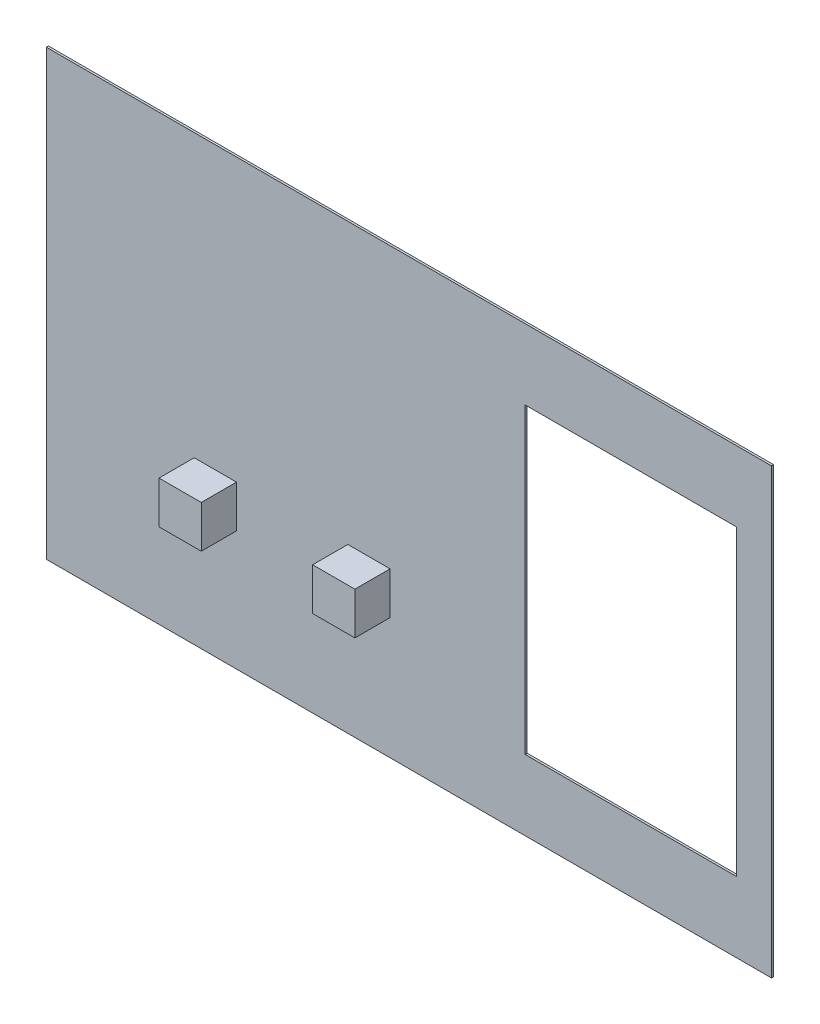
ISO-10303-21;
HEADER;
FILE_DESCRIPTION(('STEP AP214'),'2;1');
FILE_NAME('part.step','',(''),(''),'','','');
FILE_SCHEMA(('AUTOMOTIVE_DESIGN { 1 0 10303 214 1 1 1 1 }'));
ENDSEC;
DATA;
#1=APPLICATION_CONTEXT('core data for automotive mechanical design processes');
#2=APPLICATION_PROTOCOL_DEFINITION('international standard','automotive_design',2000,#1);
#3=PRODUCT_CONTEXT('',#1,'mechanical');
#4=PRODUCT('Part','Part','',(#3));
#5=PRODUCT_RELATED_PRODUCT_CATEGORY('part','',(#4));
#6=PRODUCT_DEFINITION_FORMATION('','',#4);
#7=PRODUCT_DEFINITION_CONTEXT('part definition',#1,'design');
#8=PRODUCT_DEFINITION('design','',#6,#7);
#9=PRODUCT_DEFINITION_SHAPE('','',#8);
#10=(LENGTH_UNIT() NAMED_UNIT(*) SI_UNIT(.MILLI.,.METRE.));
#11=(NAMED_UNIT(*) PLANE_ANGLE_UNIT() SI_UNIT($,.RADIAN.));
#12=(NAMED_UNIT(*) SI_UNIT($,.STERADIAN.) SOLID_ANGLE_UNIT());
#13=UNCERTAINTY_MEASURE_WITH_UNIT(LENGTH_MEASURE(1.E-05),#10,'distance_accuracy_value','');
#14=(GEOMETRIC_REPRESENTATION_CONTEXT(3) GLOBAL_UNCERTAINTY_ASSIGNED_CONTEXT((#13)) GLOBAL_UNIT_ASSIGNED_CONTEXT((#10,
#11,#12)) REPRESENTATION_CONTEXT('',''));
#15=CARTESIAN_POINT('',(0.,0.,0.));
#16=DIRECTION('',(0.,0.,1.));
#17=DIRECTION('',(1.,0.,0.));
#18=AXIS2_PLACEMENT_3D('',#15,#16,#17);
#19=CARTESIAN_POINT('',(-26.7765595074968,-82.5431676674339,53.));
#20=DIRECTION('',(-1.,0.,0.));
#21=DIRECTION('',(0.,-1.,0.));
#22=AXIS2_PLACEMENT_3D('',#19,#20,#21);
#23=PLANE('',#22);
#24=DIRECTION('',(0.,1.,0.));
#25=VECTOR('',#24,1.);
#26=CARTESIAN_POINT('',(-26.7765595074968,-82.5431676674339,3.));
#27=LINE('',#26,#25);
#28=CARTESIAN_POINT('',(-26.7765595074968,-142.543167667434,3.));
#29=VERTEX_POINT('',#28);
#30=CARTESIAN_POINT('',(-26.7765595074968,-82.5431676674339,3.));
#31=VERTEX_POINT('',#30);
#32=EDGE_CURVE('E107',#29,#31,#27,.T.);
#33=ORIENTED_EDGE('',*,*,#32,.T.);
#34=DIRECTION('',(0.,0.,-1.));
#35=VECTOR('',#34,1.);
#36=CARTESIAN_POINT('',(-26.7765595074968,-82.5431676674339,53.));
#37=LINE('',#36,#35);
#38=CARTESIAN_POINT('',(-26.7765595074968,-82.5431676674339,53.));
#39=VERTEX_POINT('',#38);
#40=EDGE_CURVE('E12',#39,#31,#37,.T.);
#41=ORIENTED_EDGE('',*,*,#40,.F.);
#42=DIRECTION('',(0.,1.,0.));
#43=VECTOR('',#42,1.);
#44=CARTESIAN_POINT('',(-26.7765595074968,-82.5431676674339,53.));
#45=LINE('',#44,#43);
#46=CARTESIAN_POINT('',(-26.7765595074968,-142.543167667434,53.));
#47=VERTEX_POINT('',#46);
#48=EDGE_CURVE('E95',#47,#39,#45,.T.);
#49=ORIENTED_EDGE('',*,*,#48,.F.);
#50=DIRECTION('',(0.,0.,-1.));
#51=VECTOR('',#50,1.);
#52=CARTESIAN_POINT('',(-26.7765595074968,-142.543167667434,53.));
#53=LINE('',#52,#51);
#54=EDGE_CURVE('E103',#47,#29,#53,.T.);
#55=ORIENTED_EDGE('',*,*,#54,.T.);
#56=EDGE_LOOP('',(#33,#41,#49,#55));
#57=FACE_BOUND('',#56,.T.);
#58=ADVANCED_FACE('F44',(#57),#23,.F.);
#59=CARTESIAN_POINT('',(-86.7765595074968,-82.5431676674339,53.));
#60=DIRECTION('',(0.,-1.,0.));
#61=DIRECTION('',(0.,0.,-1.));
#62=AXIS2_PLACEMENT_3D('',#59,#60,#61);
#63=PLANE('',#62);
#64=DIRECTION('',(-1.,0.,0.));
#65=VECTOR('',#64,1.);
#66=CARTESIAN_POINT('',(-86.7765595074968,-82.5431676674339,3.));
#67=LINE('',#66,#65);
#68=CARTESIAN_POINT('',(-86.7765595074968,-82.5431676674339,3.));
#69=VERTEX_POINT('',#68);
#70=EDGE_CURVE('E99',#31,#69,#67,.T.);
#71=ORIENTED_EDGE('',*,*,#70,.T.);
#72=DIRECTION('',(0.,0.,-1.));
#73=VECTOR('',#72,1.);
#74=CARTESIAN_POINT('',(-86.7765595074968,-82.5431676674339,53.));
#75=LINE('',#74,#73);
#76=CARTESIAN_POINT('',(-86.7765595074968,-82.5431676674339,53.));
#77=VERTEX_POINT('',#76);
#78=EDGE_CURVE('E52',#77,#69,#75,.T.);
#79=ORIENTED_EDGE('',*,*,#78,.F.);
#80=DIRECTION('',(-1.,0.,0.));
#81=VECTOR('',#80,1.);
#82=CARTESIAN_POINT('',(-86.7765595074968,-82.5431676674339,53.));
#83=LINE('',#82,#81);
#84=EDGE_CURVE('E90',#39,#77,#83,.T.);
#85=ORIENTED_EDGE('',*,*,#84,.F.);
#86=ORIENTED_EDGE('',*,*,#40,.T.);
#87=EDGE_LOOP('',(#71,#79,#85,#86));
#88=FACE_BOUND('',#87,.T.);
#89=ADVANCED_FACE('F98',(#88),#63,.F.);
#90=CARTESIAN_POINT('',(-86.7765595074968,-142.543167667434,53.));
#91=DIRECTION('',(1.,0.,0.));
#92=DIRECTION('',(0.,1.,0.));
#93=AXIS2_PLACEMENT_3D('',#90,#91,#92);
#94=PLANE('',#93);
#95=DIRECTION('',(0.,-1.,0.));
#96=VECTOR('',#95,1.);
#97=CARTESIAN_POINT('',(-86.7765595074968,-142.543167667434,3.));
#98=LINE('',#97,#96);
#99=CARTESIAN_POINT('',(-86.7765595074968,-142.543167667434,3.));
#100=VERTEX_POINT('',#99);
#101=EDGE_CURVE('E77',#69,#100,#98,.T.);
#102=ORIENTED_EDGE('',*,*,#101,.T.);
#103=DIRECTION('',(0.,0.,-1.));
#104=VECTOR('',#103,1.);
#105=CARTESIAN_POINT('',(-86.7765595074968,-142.543167667434,53.));
#106=LINE('',#105,#104);
#107=CARTESIAN_POINT('',(-86.7765595074968,-142.543167667434,53.));
#108=VERTEX_POINT('',#107);
#109=EDGE_CURVE('E100',#108,#100,#106,.T.);
#110=ORIENTED_EDGE('',*,*,#109,.F.);
#111=DIRECTION('',(0.,-1.,0.));
#112=VECTOR('',#111,1.);
#113=CARTESIAN_POINT('',(-86.7765595074968,-142.543167667434,53.));
#114=LINE('',#113,#112);
#115=EDGE_CURVE('E93',#77,#108,#114,.T.);
#116=ORIENTED_EDGE('',*,*,#115,.F.);
#117=ORIENTED_EDGE('',*,*,#78,.T.);
#118=EDGE_LOOP('',(#102,#110,#116,#117));
#119=FACE_BOUND('',#118,.T.);
#120=ADVANCED_FACE('F101',(#119),#94,.F.);
#121=CARTESIAN_POINT('',(-26.7765595074968,-142.543167667434,53.));
#122=DIRECTION('',(0.,1.,0.));
#123=DIRECTION('',(0.,0.,1.));
#124=AXIS2_PLACEMENT_3D('',#121,#122,#123);
#125=PLANE('',#124);
#126=DIRECTION('',(1.,0.,0.));
#127=VECTOR('',#126,1.);
#128=CARTESIAN_POINT('',(-26.7765595074968,-142.543167667434,3.));
#129=LINE('',#128,#127);
#130=EDGE_CURVE('E83',#100,#29,#129,.T.);
#131=ORIENTED_EDGE('',*,*,#130,.T.);
#132=ORIENTED_EDGE('',*,*,#54,.F.);
#133=DIRECTION('',(1.,0.,0.));
#134=VECTOR('',#133,1.);
#135=CARTESIAN_POINT('',(-26.7765595074968,-142.543167667434,53.));
#136=LINE('',#135,#134);
#137=EDGE_CURVE('E60',#108,#47,#136,.T.);
#138=ORIENTED_EDGE('',*,*,#137,.F.);
#139=ORIENTED_EDGE('',*,*,#109,.T.);
#140=EDGE_LOOP('',(#131,#132,#138,#139));
#141=FACE_BOUND('',#140,.T.);
#142=ADVANCED_FACE('F114',(#141),#125,.F.);
#143=CARTESIAN_POINT('',(0.,0.,53.));
#144=DIRECTION('',(0.,0.,-1.));
#145=DIRECTION('',(-1.,0.,0.));
#146=AXIS2_PLACEMENT_3D('',#143,#144,#145);
#147=PLANE('',#146);
#148=ORIENTED_EDGE('',*,*,#48,.T.);
#149=ORIENTED_EDGE('',*,*,#84,.T.);
#150=ORIENTED_EDGE('',*,*,#115,.T.);
#151=ORIENTED_EDGE('',*,*,#137,.T.);
#152=EDGE_LOOP('',(#148,#149,#150,#151));
#153=FACE_BOUND('',#152,.T.);
#154=ADVANCED_FACE('F91',(#153),#147,.F.);
#155=CARTESIAN_POINT('',(0.,0.,3.));
#156=DIRECTION('',(0.,0.,-1.));
#157=DIRECTION('',(-1.,0.,0.));
#158=AXIS2_PLACEMENT_3D('',#155,#156,#157);
#159=PLANE('',#158);
#160=ORIENTED_EDGE('',*,*,#32,.F.);
#161=ORIENTED_EDGE('',*,*,#130,.F.);
#162=ORIENTED_EDGE('',*,*,#101,.F.);
#163=ORIENTED_EDGE('',*,*,#70,.F.);
#164=EDGE_LOOP('',(#160,#161,#162,#163));
#165=FACE_BOUND('',#164,.T.);
#166=ADVANCED_FACE('F117',(#165),#159,.T.);
#167=CLOSED_SHELL('',(#58,#89,#120,#142,#154,#166));
#168=MANIFOLD_SOLID_BREP('B2',#167);
#169=CARTESIAN_POINT('',(-245.,-85.,53.));
#170=DIRECTION('',(-1.,0.,0.));
#171=DIRECTION('',(0.,0.,1.));
#172=AXIS2_PLACEMENT_3D('',#169,#170,#171);
#173=PLANE('',#172);
#174=DIRECTION('',(0.,1.,0.));
#175=VECTOR('',#174,1.);
#176=CARTESIAN_POINT('',(-245.,-85.,3.));
#177=LINE('',#176,#175);
#178=CARTESIAN_POINT('',(-245.,-145.,3.));
#179=VERTEX_POINT('',#178);
#180=CARTESIAN_POINT('',(-245.,-85.,3.));
#181=VERTEX_POINT('',#180);
#182=EDGE_CURVE('E240',#179,#181,#177,.T.);
#183=ORIENTED_EDGE('',*,*,#182,.T.);
#184=DIRECTION('',(0.,0.,-1.));
#185=VECTOR('',#184,1.);
#186=CARTESIAN_POINT('',(-245.,-85.,53.));
#187=LINE('',#186,#185);
#188=CARTESIAN_POINT('',(-245.,-85.,53.));
#189=VERTEX_POINT('',#188);
#190=EDGE_CURVE('E42',#189,#181,#187,.T.);
#191=ORIENTED_EDGE('',*,*,#190,.F.);
#192=DIRECTION('',(0.,1.,0.));
#193=VECTOR('',#192,1.);
#194=CARTESIAN_POINT('',(-245.,-85.,53.));
#195=LINE('',#194,#193);
#196=CARTESIAN_POINT('',(-245.,-145.,53.));
#197=VERTEX_POINT('',#196);
#198=EDGE_CURVE('E228',#197,#189,#195,.T.);
#199=ORIENTED_EDGE('',*,*,#198,.F.);
#200=DIRECTION('',(0.,0.,-1.));
#201=VECTOR('',#200,1.);
#202=CARTESIAN_POINT('',(-245.,-145.,53.));
#203=LINE('',#202,#201);
#204=EDGE_CURVE('E236',#197,#179,#203,.T.);
#205=ORIENTED_EDGE('',*,*,#204,.T.);
#206=EDGE_LOOP('',(#183,#191,#199,#205));
#207=FACE_BOUND('',#206,.T.);
#208=ADVANCED_FACE('F177',(#207),#173,.F.);
#209=CARTESIAN_POINT('',(-305.,-85.,53.));
#210=DIRECTION('',(0.,-1.,0.));
#211=DIRECTION('',(1.,0.,0.));
#212=AXIS2_PLACEMENT_3D('',#209,#210,#211);
#213=PLANE('',#212);
#214=DIRECTION('',(-1.,0.,0.));
#215=VECTOR('',#214,1.);
#216=CARTESIAN_POINT('',(-305.,-85.,3.));
#217=LINE('',#216,#215);
#218=CARTESIAN_POINT('',(-305.,-85.,3.));
#219=VERTEX_POINT('',#218);
#220=EDGE_CURVE('E232',#181,#219,#217,.T.);
#221=ORIENTED_EDGE('',*,*,#220,.T.);
#222=DIRECTION('',(0.,0.,-1.));
#223=VECTOR('',#222,1.);
#224=CARTESIAN_POINT('',(-305.,-85.,53.));
#225=LINE('',#224,#223);
#226=CARTESIAN_POINT('',(-305.,-85.,53.));
#227=VERTEX_POINT('',#226);
#228=EDGE_CURVE('E185',#227,#219,#225,.T.);
#229=ORIENTED_EDGE('',*,*,#228,.F.);
#230=DIRECTION('',(-1.,0.,0.));
#231=VECTOR('',#230,1.);
#232=CARTESIAN_POINT('',(-305.,-85.,53.));
#233=LINE('',#232,#231);
#234=EDGE_CURVE('E223',#189,#227,#233,.T.);
#235=ORIENTED_EDGE('',*,*,#234,.F.);
#236=ORIENTED_EDGE('',*,*,#190,.T.);
#237=EDGE_LOOP('',(#221,#229,#235,#236));
#238=FACE_BOUND('',#237,.T.);
#239=ADVANCED_FACE('F231',(#238),#213,.F.);
#240=CARTESIAN_POINT('',(-305.,-145.,53.));
#241=DIRECTION('',(1.,0.,0.));
#242=DIRECTION('',(0.,0.,-1.));
#243=AXIS2_PLACEMENT_3D('',#240,#241,#242);
#244=PLANE('',#243);
#245=DIRECTION('',(0.,-1.,0.));
#246=VECTOR('',#245,1.);
#247=CARTESIAN_POINT('',(-305.,-145.,3.));
#248=LINE('',#247,#246);
#249=CARTESIAN_POINT('',(-305.,-145.,3.));
#250=VERTEX_POINT('',#249);
#251=EDGE_CURVE('E210',#219,#250,#248,.T.);
#252=ORIENTED_EDGE('',*,*,#251,.T.);
#253=DIRECTION('',(0.,0.,-1.));
#254=VECTOR('',#253,1.);
#255=CARTESIAN_POINT('',(-305.,-145.,53.));
#256=LINE('',#255,#254);
#257=CARTESIAN_POINT('',(-305.,-145.,53.));
#258=VERTEX_POINT('',#257);
#259=EDGE_CURVE('E233',#258,#250,#256,.T.);
#260=ORIENTED_EDGE('',*,*,#259,.F.);
#261=DIRECTION('',(0.,-1.,0.));
#262=VECTOR('',#261,1.);
#263=CARTESIAN_POINT('',(-305.,-145.,53.));
#264=LINE('',#263,#262);
#265=EDGE_CURVE('E226',#227,#258,#264,.T.);
#266=ORIENTED_EDGE('',*,*,#265,.F.);
#267=ORIENTED_EDGE('',*,*,#228,.T.);
#268=EDGE_LOOP('',(#252,#260,#266,#267));
#269=FACE_BOUND('',#268,.T.);
#270=ADVANCED_FACE('F234',(#269),#244,.F.);
#271=CARTESIAN_POINT('',(-245.,-145.,53.));
#272=DIRECTION('',(0.,1.,0.));
#273=DIRECTION('',(0.,0.,1.));
#274=AXIS2_PLACEMENT_3D('',#271,#272,#273);
#275=PLANE('',#274);
#276=DIRECTION('',(1.,0.,0.));
#277=VECTOR('',#276,1.);
#278=CARTESIAN_POINT('',(-245.,-145.,3.));
#279=LINE('',#278,#277);
#280=EDGE_CURVE('E216',#250,#179,#279,.T.);
#281=ORIENTED_EDGE('',*,*,#280,.T.);
#282=ORIENTED_EDGE('',*,*,#204,.F.);
#283=DIRECTION('',(1.,0.,0.));
#284=VECTOR('',#283,1.);
#285=CARTESIAN_POINT('',(-245.,-145.,53.));
#286=LINE('',#285,#284);
#287=EDGE_CURVE('E193',#258,#197,#286,.T.);
#288=ORIENTED_EDGE('',*,*,#287,.F.);
#289=ORIENTED_EDGE('',*,*,#259,.T.);
#290=EDGE_LOOP('',(#281,#282,#288,#289));
#291=FACE_BOUND('',#290,.T.);
#292=ADVANCED_FACE('F247',(#291),#275,.F.);
#293=CARTESIAN_POINT('',(0.,0.,53.));
#294=DIRECTION('',(0.,0.,-1.));
#295=DIRECTION('',(-1.,0.,0.));
#296=AXIS2_PLACEMENT_3D('',#293,#294,#295);
#297=PLANE('',#296);
#298=ORIENTED_EDGE('',*,*,#198,.T.);
#299=ORIENTED_EDGE('',*,*,#234,.T.);
#300=ORIENTED_EDGE('',*,*,#265,.T.);
#301=ORIENTED_EDGE('',*,*,#287,.T.);
#302=EDGE_LOOP('',(#298,#299,#300,#301));
#303=FACE_BOUND('',#302,.T.);
#304=ADVANCED_FACE('F224',(#303),#297,.F.);
#305=CARTESIAN_POINT('',(0.,0.,3.));
#306=DIRECTION('',(0.,0.,-1.));
#307=DIRECTION('',(-1.,0.,0.));
#308=AXIS2_PLACEMENT_3D('',#305,#306,#307);
#309=PLANE('',#308);
#310=ORIENTED_EDGE('',*,*,#182,.F.);
#311=ORIENTED_EDGE('',*,*,#280,.F.);
#312=ORIENTED_EDGE('',*,*,#251,.F.);
#313=ORIENTED_EDGE('',*,*,#220,.F.);
#314=EDGE_LOOP('',(#310,#311,#312,#313));
#315=FACE_BOUND('',#314,.T.);
#316=ADVANCED_FACE('F250',(#315),#309,.T.);
#317=CLOSED_SHELL('',(#208,#239,#270,#292,#304,#316));
#318=MANIFOLD_SOLID_BREP('B6',#317);
#319=CARTESIAN_POINT('',(515.,-315.,3.));
#320=DIRECTION('',(-1.,0.,0.));
#321=DIRECTION('',(0.,0.,1.));
#322=AXIS2_PLACEMENT_3D('',#319,#320,#321);
#323=PLANE('',#322);
#324=DIRECTION('',(0.,1.,0.));
#325=VECTOR('',#324,1.);
#326=CARTESIAN_POINT('',(515.,-315.,0.));
#327=LINE('',#326,#325);
#328=CARTESIAN_POINT('',(515.,-315.,0.));
#329=VERTEX_POINT('',#328);
#330=CARTESIAN_POINT('',(515.,315.,0.));
#331=VERTEX_POINT('',#330);
#332=EDGE_CURVE('E520',#329,#331,#327,.T.);
#333=ORIENTED_EDGE('',*,*,#332,.T.);
#334=DIRECTION('',(0.,0.,-1.));
#335=VECTOR('',#334,1.);
#336=CARTESIAN_POINT('',(515.,315.,3.));
#337=LINE('',#336,#335);
#338=CARTESIAN_POINT('',(515.,315.,3.));
#339=VERTEX_POINT('',#338);
#340=EDGE_CURVE('E175',#339,#331,#337,.T.);
#341=ORIENTED_EDGE('',*,*,#340,.F.);
#342=DIRECTION('',(0.,1.,0.));
#343=VECTOR('',#342,1.);
#344=CARTESIAN_POINT('',(515.,-315.,3.));
#345=LINE('',#344,#343);
#346=CARTESIAN_POINT('',(515.,-315.,3.));
#347=VERTEX_POINT('',#346);
#348=EDGE_CURVE('E521',#347,#339,#345,.T.);
#349=ORIENTED_EDGE('',*,*,#348,.F.);
#350=DIRECTION('',(0.,0.,-1.));
#351=VECTOR('',#350,1.);
#352=CARTESIAN_POINT('',(515.,-315.,3.));
#353=LINE('',#352,#351);
#354=EDGE_CURVE('E531',#347,#329,#353,.T.);
#355=ORIENTED_EDGE('',*,*,#354,.T.);
#356=EDGE_LOOP('',(#333,#341,#349,#355));
#357=FACE_BOUND('',#356,.T.);
#358=ADVANCED_FACE('F301',(#357),#323,.F.);
#359=CARTESIAN_POINT('',(-515.,315.,3.));
#360=DIRECTION('',(0.,-1.,0.));
#361=DIRECTION('',(0.,0.,-1.));
#362=AXIS2_PLACEMENT_3D('',#359,#360,#361);
#363=PLANE('',#362);
#364=DIRECTION('',(-1.,0.,0.));
#365=VECTOR('',#364,1.);
#366=CARTESIAN_POINT('',(-515.,315.,0.));
#367=LINE('',#366,#365);
#368=CARTESIAN_POINT('',(-515.,315.,0.));
#369=VERTEX_POINT('',#368);
#370=EDGE_CURVE('E534',#331,#369,#367,.T.);
#371=ORIENTED_EDGE('',*,*,#370,.T.);
#372=DIRECTION('',(0.,0.,-1.));
#373=VECTOR('',#372,1.);
#374=CARTESIAN_POINT('',(-515.,315.,3.));
#375=LINE('',#374,#373);
#376=CARTESIAN_POINT('',(-515.,315.,3.));
#377=VERTEX_POINT('',#376);
#378=EDGE_CURVE('E308',#377,#369,#375,.T.);
#379=ORIENTED_EDGE('',*,*,#378,.F.);
#380=DIRECTION('',(-1.,0.,0.));
#381=VECTOR('',#380,1.);
#382=CARTESIAN_POINT('',(-515.,315.,3.));
#383=LINE('',#382,#381);
#384=EDGE_CURVE('E524',#339,#377,#383,.T.);
#385=ORIENTED_EDGE('',*,*,#384,.F.);
#386=ORIENTED_EDGE('',*,*,#340,.T.);
#387=EDGE_LOOP('',(#371,#379,#385,#386));
#388=FACE_BOUND('',#387,.T.);
#389=ADVANCED_FACE('F563',(#388),#363,.F.);
#390=CARTESIAN_POINT('',(-515.,-315.,3.));
#391=DIRECTION('',(1.,0.,0.));
#392=DIRECTION('',(0.,0.,-1.));
#393=AXIS2_PLACEMENT_3D('',#390,#391,#392);
#394=PLANE('',#393);
#395=DIRECTION('',(0.,-1.,0.));
#396=VECTOR('',#395,1.);
#397=CARTESIAN_POINT('',(-515.,-315.,0.));
#398=LINE('',#397,#396);
#399=CARTESIAN_POINT('',(-515.,-315.,0.));
#400=VERTEX_POINT('',#399);
#401=EDGE_CURVE('E536',#369,#400,#398,.T.);
#402=ORIENTED_EDGE('',*,*,#401,.T.);
#403=DIRECTION('',(0.,0.,-1.));
#404=VECTOR('',#403,1.);
#405=CARTESIAN_POINT('',(-515.,-315.,3.));
#406=LINE('',#405,#404);
#407=CARTESIAN_POINT('',(-515.,-315.,3.));
#408=VERTEX_POINT('',#407);
#409=EDGE_CURVE('E541',#408,#400,#406,.T.);
#410=ORIENTED_EDGE('',*,*,#409,.F.);
#411=DIRECTION('',(0.,-1.,0.));
#412=VECTOR('',#411,1.);
#413=CARTESIAN_POINT('',(-515.,-315.,3.));
#414=LINE('',#413,#412);
#415=EDGE_CURVE('E527',#377,#408,#414,.T.);
#416=ORIENTED_EDGE('',*,*,#415,.F.);
#417=ORIENTED_EDGE('',*,*,#378,.T.);
#418=EDGE_LOOP('',(#402,#410,#416,#417));
#419=FACE_BOUND('',#418,.T.);
#420=ADVANCED_FACE('F548',(#419),#394,.F.);
#421=CARTESIAN_POINT('',(-515.,-315.,3.));
#422=DIRECTION('',(0.,1.,0.));
#423=DIRECTION('',(0.,0.,1.));
#424=AXIS2_PLACEMENT_3D('',#421,#422,#423);
#425=PLANE('',#424);
#426=DIRECTION('',(1.,0.,0.));
#427=VECTOR('',#426,1.);
#428=CARTESIAN_POINT('',(-515.,-315.,0.));
#429=LINE('',#428,#427);
#430=EDGE_CURVE('E525',#400,#329,#429,.T.);
#431=ORIENTED_EDGE('',*,*,#430,.T.);
#432=ORIENTED_EDGE('',*,*,#354,.F.);
#433=DIRECTION('',(1.,0.,0.));
#434=VECTOR('',#433,1.);
#435=CARTESIAN_POINT('',(-515.,-315.,3.));
#436=LINE('',#435,#434);
#437=EDGE_CURVE('E529',#408,#347,#436,.T.);
#438=ORIENTED_EDGE('',*,*,#437,.F.);
#439=ORIENTED_EDGE('',*,*,#409,.T.);
#440=EDGE_LOOP('',(#431,#432,#438,#439));
#441=FACE_BOUND('',#440,.T.);
#442=ADVANCED_FACE('F556',(#441),#425,.F.);
#443=CARTESIAN_POINT('',(0.,0.,3.));
#444=DIRECTION('',(0.,0.,-1.));
#445=DIRECTION('',(-1.,0.,0.));
#446=AXIS2_PLACEMENT_3D('',#443,#444,#445);
#447=PLANE('',#446);
#448=DIRECTION('',(1.,0.,0.));
#449=VECTOR('',#448,1.);
#450=CARTESIAN_POINT('',(0.,-84.9999999999999,3.));
#451=LINE('',#450,#449);
#452=CARTESIAN_POINT('',(-305.,-85.,3.));
#453=VERTEX_POINT('',#452);
#454=CARTESIAN_POINT('',(-245.,-85.,3.));
#455=VERTEX_POINT('',#454);
#456=EDGE_CURVE('E479',#453,#455,#451,.T.);
#457=ORIENTED_EDGE('',*,*,#456,.T.);
#458=DIRECTION('',(0.,-1.,0.));
#459=VECTOR('',#458,1.);
#460=CARTESIAN_POINT('',(-245.,0.,3.));
#461=LINE('',#460,#459);
#462=CARTESIAN_POINT('',(-245.,-145.,3.));
#463=VERTEX_POINT('',#462);
#464=EDGE_CURVE('E418',#455,#463,#461,.T.);
#465=ORIENTED_EDGE('',*,*,#464,.T.);
#466=DIRECTION('',(-1.,0.,0.));
#467=VECTOR('',#466,1.);
#468=CARTESIAN_POINT('',(0.,-145.,3.));
#469=LINE('',#468,#467);
#470=CARTESIAN_POINT('',(-305.,-145.,3.));
#471=VERTEX_POINT('',#470);
#472=EDGE_CURVE('E484',#463,#471,#469,.T.);
#473=ORIENTED_EDGE('',*,*,#472,.T.);
#474=DIRECTION('',(0.,1.,0.));
#475=VECTOR('',#474,1.);
#476=CARTESIAN_POINT('',(-305.,0.,3.));
#477=LINE('',#476,#475);
#478=EDGE_CURVE('E481',#471,#453,#477,.T.);
#479=ORIENTED_EDGE('',*,*,#478,.T.);
#480=EDGE_LOOP('',(#457,#465,#473,#479));
#481=FACE_BOUND('',#480,.T.);
#482=DIRECTION('',(-1.,0.,0.));
#483=VECTOR('',#482,1.);
#484=CARTESIAN_POINT('',(0.,-142.543167667434,3.));
#485=LINE('',#484,#483);
#486=CARTESIAN_POINT('',(-26.7765595074968,-142.543167667434,3.));
#487=VERTEX_POINT('',#486);
#488=CARTESIAN_POINT('',(-86.7765595074968,-142.543167667434,3.));
#489=VERTEX_POINT('',#488);
#490=EDGE_CURVE('E445',#487,#489,#485,.T.);
#491=ORIENTED_EDGE('',*,*,#490,.T.);
#492=DIRECTION('',(0.,1.,0.));
#493=VECTOR('',#492,1.);
#494=CARTESIAN_POINT('',(-86.7765595074968,0.,3.));
#495=LINE('',#494,#493);
#496=CARTESIAN_POINT('',(-86.7765595074968,-82.5431676674339,3.));
#497=VERTEX_POINT('',#496);
#498=EDGE_CURVE('E476',#489,#497,#495,.T.);
#499=ORIENTED_EDGE('',*,*,#498,.T.);
#500=DIRECTION('',(1.,0.,0.));
#501=VECTOR('',#500,1.);
#502=CARTESIAN_POINT('',(0.,-82.5431676674339,3.));
#503=LINE('',#502,#501);
#504=CARTESIAN_POINT('',(-26.7765595074968,-82.5431676674339,3.));
#505=VERTEX_POINT('',#504);
#506=EDGE_CURVE('E473',#497,#505,#503,.T.);
#507=ORIENTED_EDGE('',*,*,#506,.T.);
#508=DIRECTION('',(0.,-1.,0.));
#509=VECTOR('',#508,1.);
#510=CARTESIAN_POINT('',(-26.7765595074968,0.,3.));
#511=LINE('',#510,#509);
#512=EDGE_CURVE('E470',#505,#487,#511,.T.);
#513=ORIENTED_EDGE('',*,*,#512,.T.);
#514=EDGE_LOOP('',(#491,#499,#507,#513));
#515=FACE_BOUND('',#514,.T.);
#516=DIRECTION('',(-1.,0.,0.));
#517=VECTOR('',#516,1.);
#518=CARTESIAN_POINT('',(0.,-215.,3.));
#519=LINE('',#518,#517);
#520=CARTESIAN_POINT('',(465.,-215.,3.));
#521=VERTEX_POINT('',#520);
#522=CARTESIAN_POINT('',(165.,-215.,3.));
#523=VERTEX_POINT('',#522);
#524=EDGE_CURVE('E514',#521,#523,#519,.T.);
#525=ORIENTED_EDGE('',*,*,#524,.T.);
#526=DIRECTION('',(0.,1.,0.));
#527=VECTOR('',#526,1.);
#528=CARTESIAN_POINT('',(165.,0.,3.));
#529=LINE('',#528,#527);
#530=CARTESIAN_POINT('',(165.,215.,3.));
#531=VERTEX_POINT('',#530);
#532=EDGE_CURVE('E517',#523,#531,#529,.T.);
#533=ORIENTED_EDGE('',*,*,#532,.T.);
#534=DIRECTION('',(1.,0.,0.));
#535=VECTOR('',#534,1.);
#536=CARTESIAN_POINT('',(0.,215.,3.));
#537=LINE('',#536,#535);
#538=CARTESIAN_POINT('',(465.,215.,3.));
#539=VERTEX_POINT('',#538);
#540=EDGE_CURVE('E502',#531,#539,#537,.T.);
#541=ORIENTED_EDGE('',*,*,#540,.T.);
#542=DIRECTION('',(0.,-1.,0.));
#543=VECTOR('',#542,1.);
#544=CARTESIAN_POINT('',(465.,1.20059001500162E-13,3.));
#545=LINE('',#544,#543);
#546=EDGE_CURVE('E511',#539,#521,#545,.T.);
#547=ORIENTED_EDGE('',*,*,#546,.T.);
#548=EDGE_LOOP('',(#525,#533,#541,#547));
#549=FACE_BOUND('',#548,.T.);
#550=ORIENTED_EDGE('',*,*,#348,.T.);
#551=ORIENTED_EDGE('',*,*,#384,.T.);
#552=ORIENTED_EDGE('',*,*,#415,.T.);
#553=ORIENTED_EDGE('',*,*,#437,.T.);
#554=EDGE_LOOP('',(#550,#551,#552,#553));
#555=FACE_BOUND('',#554,.T.);
#556=ADVANCED_FACE('F562',(#481,#515,#549,#555),#447,.F.);
#557=CARTESIAN_POINT('',(0.,0.,0.));
#558=DIRECTION('',(0.,0.,-1.));
#559=DIRECTION('',(-1.,0.,0.));
#560=AXIS2_PLACEMENT_3D('',#557,#558,#559);
#561=PLANE('',#560);
#562=DIRECTION('',(0.,1.,0.));
#563=VECTOR('',#562,1.);
#564=CARTESIAN_POINT('',(-245.,-145.,0.));
#565=LINE('',#564,#563);
#566=CARTESIAN_POINT('',(-245.,-145.,0.));
#567=VERTEX_POINT('',#566);
#568=CARTESIAN_POINT('',(-245.,-85.,0.));
#569=VERTEX_POINT('',#568);
#570=EDGE_CURVE('E415',#567,#569,#565,.T.);
#571=ORIENTED_EDGE('',*,*,#570,.T.);
#572=DIRECTION('',(-1.,0.,0.));
#573=VECTOR('',#572,1.);
#574=CARTESIAN_POINT('',(-305.,-85.,0.));
#575=LINE('',#574,#573);
#576=CARTESIAN_POINT('',(-305.,-85.,0.));
#577=VERTEX_POINT('',#576);
#578=EDGE_CURVE('E425',#569,#577,#575,.T.);
#579=ORIENTED_EDGE('',*,*,#578,.T.);
#580=DIRECTION('',(0.,-1.,0.));
#581=VECTOR('',#580,1.);
#582=CARTESIAN_POINT('',(-305.,-145.,0.));
#583=LINE('',#582,#581);
#584=CARTESIAN_POINT('',(-305.,-145.,0.));
#585=VERTEX_POINT('',#584);
#586=EDGE_CURVE('E430',#577,#585,#583,.T.);
#587=ORIENTED_EDGE('',*,*,#586,.T.);
#588=DIRECTION('',(1.,0.,0.));
#589=VECTOR('',#588,1.);
#590=CARTESIAN_POINT('',(-305.,-145.,0.));
#591=LINE('',#590,#589);
#592=EDGE_CURVE('E421',#585,#567,#591,.T.);
#593=ORIENTED_EDGE('',*,*,#592,.T.);
#594=EDGE_LOOP('',(#571,#579,#587,#593));
#595=FACE_BOUND('',#594,.T.);
#596=DIRECTION('',(0.,-1.,0.));
#597=VECTOR('',#596,1.);
#598=CARTESIAN_POINT('',(-86.7765595074968,-142.543167667434,0.));
#599=LINE('',#598,#597);
#600=CARTESIAN_POINT('',(-86.7765595074968,-82.5431676674339,0.));
#601=VERTEX_POINT('',#600);
#602=CARTESIAN_POINT('',(-86.7765595074968,-142.543167667434,0.));
#603=VERTEX_POINT('',#602);
#604=EDGE_CURVE('E450',#601,#603,#599,.T.);
#605=ORIENTED_EDGE('',*,*,#604,.T.);
#606=DIRECTION('',(1.,0.,0.));
#607=VECTOR('',#606,1.);
#608=CARTESIAN_POINT('',(-26.7765595074968,-142.543167667434,0.));
#609=LINE('',#608,#607);
#610=CARTESIAN_POINT('',(-26.7765595074968,-142.543167667434,0.));
#611=VERTEX_POINT('',#610);
#612=EDGE_CURVE('E453',#603,#611,#609,.T.);
#613=ORIENTED_EDGE('',*,*,#612,.T.);
#614=DIRECTION('',(0.,1.,0.));
#615=VECTOR('',#614,1.);
#616=CARTESIAN_POINT('',(-26.7765595074968,-142.543167667434,0.));
#617=LINE('',#616,#615);
#618=CARTESIAN_POINT('',(-26.7765595074968,-82.5431676674339,0.));
#619=VERTEX_POINT('',#618);
#620=EDGE_CURVE('E456',#611,#619,#617,.T.);
#621=ORIENTED_EDGE('',*,*,#620,.T.);
#622=DIRECTION('',(-1.,0.,0.));
#623=VECTOR('',#622,1.);
#624=CARTESIAN_POINT('',(-26.7765595074968,-82.5431676674339,0.));
#625=LINE('',#624,#623);
#626=EDGE_CURVE('E459',#619,#601,#625,.T.);
#627=ORIENTED_EDGE('',*,*,#626,.T.);
#628=EDGE_LOOP('',(#605,#613,#621,#627));
#629=FACE_BOUND('',#628,.T.);
#630=DIRECTION('',(0.,1.,0.));
#631=VECTOR('',#630,1.);
#632=CARTESIAN_POINT('',(165.,215.,0.));
#633=LINE('',#632,#631);
#634=CARTESIAN_POINT('',(165.,-215.,0.));
#635=VERTEX_POINT('',#634);
#636=CARTESIAN_POINT('',(165.,215.,0.));
#637=VERTEX_POINT('',#636);
#638=EDGE_CURVE('E488',#635,#637,#633,.T.);
#639=ORIENTED_EDGE('',*,*,#638,.F.);
#640=DIRECTION('',(-1.,0.,0.));
#641=VECTOR('',#640,1.);
#642=CARTESIAN_POINT('',(165.,-215.,0.));
#643=LINE('',#642,#641);
#644=CARTESIAN_POINT('',(465.,-215.,0.));
#645=VERTEX_POINT('',#644);
#646=EDGE_CURVE('E496',#645,#635,#643,.T.);
#647=ORIENTED_EDGE('',*,*,#646,.F.);
#648=DIRECTION('',(0.,-1.,0.));
#649=VECTOR('',#648,1.);
#650=CARTESIAN_POINT('',(465.,215.,0.));
#651=LINE('',#650,#649);
#652=CARTESIAN_POINT('',(465.,215.,0.));
#653=VERTEX_POINT('',#652);
#654=EDGE_CURVE('E493',#653,#645,#651,.T.);
#655=ORIENTED_EDGE('',*,*,#654,.F.);
#656=DIRECTION('',(1.,0.,0.));
#657=VECTOR('',#656,1.);
#658=CARTESIAN_POINT('',(165.,215.,0.));
#659=LINE('',#658,#657);
#660=EDGE_CURVE('E490',#637,#653,#659,.T.);
#661=ORIENTED_EDGE('',*,*,#660,.F.);
#662=EDGE_LOOP('',(#639,#647,#655,#661));
#663=FACE_BOUND('',#662,.T.);
#664=ORIENTED_EDGE('',*,*,#332,.F.);
#665=ORIENTED_EDGE('',*,*,#430,.F.);
#666=ORIENTED_EDGE('',*,*,#401,.F.);
#667=ORIENTED_EDGE('',*,*,#370,.F.);
#668=EDGE_LOOP('',(#664,#665,#666,#667));
#669=FACE_BOUND('',#668,.T.);
#670=ADVANCED_FACE('F432',(#595,#629,#663,#669),#561,.T.);
#671=CARTESIAN_POINT('',(165.,215.,10.));
#672=DIRECTION('',(-1.,0.,0.));
#673=DIRECTION('',(0.,0.,1.));
#674=AXIS2_PLACEMENT_3D('',#671,#672,#673);
#675=PLANE('',#674);
#676=DIRECTION('',(0.,0.,-1.));
#677=VECTOR('',#676,1.);
#678=CARTESIAN_POINT('',(165.,-215.,10.));
#679=LINE('',#678,#677);
#680=EDGE_CURVE('E500',#523,#635,#679,.T.);
#681=ORIENTED_EDGE('',*,*,#680,.T.);
#682=ORIENTED_EDGE('',*,*,#638,.T.);
#683=DIRECTION('',(0.,0.,-1.));
#684=VECTOR('',#683,1.);
#685=CARTESIAN_POINT('',(165.,215.,10.));
#686=LINE('',#685,#684);
#687=EDGE_CURVE('E499',#531,#637,#686,.T.);
#688=ORIENTED_EDGE('',*,*,#687,.F.);
#689=ORIENTED_EDGE('',*,*,#532,.F.);
#690=EDGE_LOOP('',(#681,#682,#688,#689));
#691=FACE_BOUND('',#690,.T.);
#692=ADVANCED_FACE('F575',(#691),#675,.F.);
#693=CARTESIAN_POINT('',(165.,-215.,10.));
#694=DIRECTION('',(0.,-1.,0.));
#695=DIRECTION('',(0.,0.,-1.));
#696=AXIS2_PLACEMENT_3D('',#693,#694,#695);
#697=PLANE('',#696);
#698=DIRECTION('',(0.,0.,-1.));
#699=VECTOR('',#698,1.);
#700=CARTESIAN_POINT('',(465.,-215.,10.));
#701=LINE('',#700,#699);
#702=EDGE_CURVE('E503',#521,#645,#701,.T.);
#703=ORIENTED_EDGE('',*,*,#702,.T.);
#704=ORIENTED_EDGE('',*,*,#646,.T.);
#705=ORIENTED_EDGE('',*,*,#680,.F.);
#706=ORIENTED_EDGE('',*,*,#524,.F.);
#707=EDGE_LOOP('',(#703,#704,#705,#706));
#708=FACE_BOUND('',#707,.T.);
#709=ADVANCED_FACE('F581',(#708),#697,.F.);
#710=CARTESIAN_POINT('',(465.,215.,10.));
#711=DIRECTION('',(1.,0.,0.));
#712=DIRECTION('',(0.,1.,0.));
#713=AXIS2_PLACEMENT_3D('',#710,#711,#712);
#714=PLANE('',#713);
#715=DIRECTION('',(0.,0.,-1.));
#716=VECTOR('',#715,1.);
#717=CARTESIAN_POINT('',(465.,215.,10.));
#718=LINE('',#717,#716);
#719=EDGE_CURVE('E505',#539,#653,#718,.T.);
#720=ORIENTED_EDGE('',*,*,#719,.T.);
#721=ORIENTED_EDGE('',*,*,#654,.T.);
#722=ORIENTED_EDGE('',*,*,#702,.F.);
#723=ORIENTED_EDGE('',*,*,#546,.F.);
#724=EDGE_LOOP('',(#720,#721,#722,#723));
#725=FACE_BOUND('',#724,.T.);
#726=ADVANCED_FACE('F587',(#725),#714,.F.);
#727=CARTESIAN_POINT('',(165.,215.,10.));
#728=DIRECTION('',(0.,1.,0.));
#729=DIRECTION('',(0.,0.,1.));
#730=AXIS2_PLACEMENT_3D('',#727,#728,#729);
#731=PLANE('',#730);
#732=ORIENTED_EDGE('',*,*,#687,.T.);
#733=ORIENTED_EDGE('',*,*,#660,.T.);
#734=ORIENTED_EDGE('',*,*,#719,.F.);
#735=ORIENTED_EDGE('',*,*,#540,.F.);
#736=EDGE_LOOP('',(#732,#733,#734,#735));
#737=FACE_BOUND('',#736,.T.);
#738=ADVANCED_FACE('F583',(#737),#731,.F.);
#739=CARTESIAN_POINT('',(-86.7765595074968,-142.543167667434,0.));
#740=DIRECTION('',(-1.,0.,0.));
#741=DIRECTION('',(0.,-1.,0.));
#742=AXIS2_PLACEMENT_3D('',#739,#740,#741);
#743=PLANE('',#742);
#744=DIRECTION('',(0.,0.,1.));
#745=VECTOR('',#744,1.);
#746=CARTESIAN_POINT('',(-86.7765595074968,-142.543167667434,0.));
#747=LINE('',#746,#745);
#748=EDGE_CURVE('E323',#603,#489,#747,.T.);
#749=ORIENTED_EDGE('',*,*,#748,.F.);
#750=ORIENTED_EDGE('',*,*,#604,.F.);
#751=DIRECTION('',(0.,0.,1.));
#752=VECTOR('',#751,1.);
#753=CARTESIAN_POINT('',(-86.7765595074968,-82.5431676674339,0.));
#754=LINE('',#753,#752);
#755=EDGE_CURVE('E435',#601,#497,#754,.T.);
#756=ORIENTED_EDGE('',*,*,#755,.T.);
#757=ORIENTED_EDGE('',*,*,#498,.F.);
#758=EDGE_LOOP('',(#749,#750,#756,#757));
#759=FACE_BOUND('',#758,.T.);
#760=ADVANCED_FACE('F586',(#759),#743,.F.);
#761=CARTESIAN_POINT('',(-26.7765595074968,-82.5431676674339,0.));
#762=DIRECTION('',(0.,1.,0.));
#763=DIRECTION('',(0.,0.,1.));
#764=AXIS2_PLACEMENT_3D('',#761,#762,#763);
#765=PLANE('',#764);
#766=ORIENTED_EDGE('',*,*,#755,.F.);
#767=ORIENTED_EDGE('',*,*,#626,.F.);
#768=DIRECTION('',(0.,0.,1.));
#769=VECTOR('',#768,1.);
#770=CARTESIAN_POINT('',(-26.7765595074968,-82.5431676674339,0.));
#771=LINE('',#770,#769);
#772=EDGE_CURVE('E438',#619,#505,#771,.T.);
#773=ORIENTED_EDGE('',*,*,#772,.T.);
#774=ORIENTED_EDGE('',*,*,#506,.F.);
#775=EDGE_LOOP('',(#766,#767,#773,#774));
#776=FACE_BOUND('',#775,.T.);
#777=ADVANCED_FACE('F597',(#776),#765,.F.);
#778=CARTESIAN_POINT('',(-26.7765595074968,-142.543167667434,0.));
#779=DIRECTION('',(1.,0.,0.));
#780=DIRECTION('',(0.,1.,0.));
#781=AXIS2_PLACEMENT_3D('',#778,#779,#780);
#782=PLANE('',#781);
#783=ORIENTED_EDGE('',*,*,#772,.F.);
#784=ORIENTED_EDGE('',*,*,#620,.F.);
#785=DIRECTION('',(0.,0.,1.));
#786=VECTOR('',#785,1.);
#787=CARTESIAN_POINT('',(-26.7765595074968,-142.543167667434,0.));
#788=LINE('',#787,#786);
#789=EDGE_CURVE('E464',#611,#487,#788,.T.);
#790=ORIENTED_EDGE('',*,*,#789,.T.);
#791=ORIENTED_EDGE('',*,*,#512,.F.);
#792=EDGE_LOOP('',(#783,#784,#790,#791));
#793=FACE_BOUND('',#792,.T.);
#794=ADVANCED_FACE('F602',(#793),#782,.F.);
#795=CARTESIAN_POINT('',(-26.7765595074968,-142.543167667434,0.));
#796=DIRECTION('',(0.,-1.,0.));
#797=DIRECTION('',(0.,0.,-1.));
#798=AXIS2_PLACEMENT_3D('',#795,#796,#797);
#799=PLANE('',#798);
#800=ORIENTED_EDGE('',*,*,#789,.F.);
#801=ORIENTED_EDGE('',*,*,#612,.F.);
#802=ORIENTED_EDGE('',*,*,#748,.T.);
#803=ORIENTED_EDGE('',*,*,#490,.F.);
#804=EDGE_LOOP('',(#800,#801,#802,#803));
#805=FACE_BOUND('',#804,.T.);
#806=ADVANCED_FACE('F599',(#805),#799,.F.);
#807=CARTESIAN_POINT('',(-245.,-145.,0.));
#808=DIRECTION('',(1.,0.,0.));
#809=DIRECTION('',(0.,0.,-1.));
#810=AXIS2_PLACEMENT_3D('',#807,#808,#809);
#811=PLANE('',#810);
#812=DIRECTION('',(0.,0.,1.));
#813=VECTOR('',#812,1.);
#814=CARTESIAN_POINT('',(-245.,-85.,0.));
#815=LINE('',#814,#813);
#816=EDGE_CURVE('E315',#569,#455,#815,.T.);
#817=ORIENTED_EDGE('',*,*,#816,.F.);
#818=ORIENTED_EDGE('',*,*,#570,.F.);
#819=DIRECTION('',(0.,0.,1.));
#820=VECTOR('',#819,1.);
#821=CARTESIAN_POINT('',(-245.,-145.,0.));
#822=LINE('',#821,#820);
#823=EDGE_CURVE('E443',#567,#463,#822,.T.);
#824=ORIENTED_EDGE('',*,*,#823,.T.);
#825=ORIENTED_EDGE('',*,*,#464,.F.);
#826=EDGE_LOOP('',(#817,#818,#824,#825));
#827=FACE_BOUND('',#826,.T.);
#828=ADVANCED_FACE('F412',(#827),#811,.F.);
#829=CARTESIAN_POINT('',(-305.,-145.,0.));
#830=DIRECTION('',(0.,-1.,0.));
#831=DIRECTION('',(0.,0.,-1.));
#832=AXIS2_PLACEMENT_3D('',#829,#830,#831);
#833=PLANE('',#832);
#834=ORIENTED_EDGE('',*,*,#823,.F.);
#835=ORIENTED_EDGE('',*,*,#592,.F.);
#836=DIRECTION('',(0.,0.,1.));
#837=VECTOR('',#836,1.);
#838=CARTESIAN_POINT('',(-305.,-145.,0.));
#839=LINE('',#838,#837);
#840=EDGE_CURVE('E446',#585,#471,#839,.T.);
#841=ORIENTED_EDGE('',*,*,#840,.T.);
#842=ORIENTED_EDGE('',*,*,#472,.F.);
#843=EDGE_LOOP('',(#834,#835,#841,#842));
#844=FACE_BOUND('',#843,.T.);
#845=ADVANCED_FACE('F611',(#844),#833,.F.);
#846=CARTESIAN_POINT('',(-305.,-145.,0.));
#847=DIRECTION('',(-1.,0.,0.));
#848=DIRECTION('',(0.,0.,1.));
#849=AXIS2_PLACEMENT_3D('',#846,#847,#848);
#850=PLANE('',#849);
#851=ORIENTED_EDGE('',*,*,#840,.F.);
#852=ORIENTED_EDGE('',*,*,#586,.F.);
#853=DIRECTION('',(0.,0.,1.));
#854=VECTOR('',#853,1.);
#855=CARTESIAN_POINT('',(-305.,-85.,0.));
#856=LINE('',#855,#854);
#857=EDGE_CURVE('E420',#577,#453,#856,.T.);
#858=ORIENTED_EDGE('',*,*,#857,.T.);
#859=ORIENTED_EDGE('',*,*,#478,.F.);
#860=EDGE_LOOP('',(#851,#852,#858,#859));
#861=FACE_BOUND('',#860,.T.);
#862=ADVANCED_FACE('F614',(#861),#850,.F.);
#863=CARTESIAN_POINT('',(-305.,-85.,0.));
#864=DIRECTION('',(0.,1.,0.));
#865=DIRECTION('',(-1.,0.,0.));
#866=AXIS2_PLACEMENT_3D('',#863,#864,#865);
#867=PLANE('',#866);
#868=ORIENTED_EDGE('',*,*,#857,.F.);
#869=ORIENTED_EDGE('',*,*,#578,.F.);
#870=ORIENTED_EDGE('',*,*,#816,.T.);
#871=ORIENTED_EDGE('',*,*,#456,.F.);
#872=EDGE_LOOP('',(#868,#869,#870,#871));
#873=FACE_BOUND('',#872,.T.);
#874=ADVANCED_FACE('F426',(#873),#867,.F.);
#875=CLOSED_SHELL('',(#358,#389,#420,#442,#556,#670,#692,#709,#726,#738,#760,#777,#794,#806,
#828,#845,#862,#874));
#876=MANIFOLD_SOLID_BREP('B36',#875);
#877=ADVANCED_BREP_SHAPE_REPRESENTATION('',(#18,#168,#318,#876),#14);
#878=SHAPE_DEFINITION_REPRESENTATION(#9,#877);
ENDSEC;
END-ISO-10303-21;
